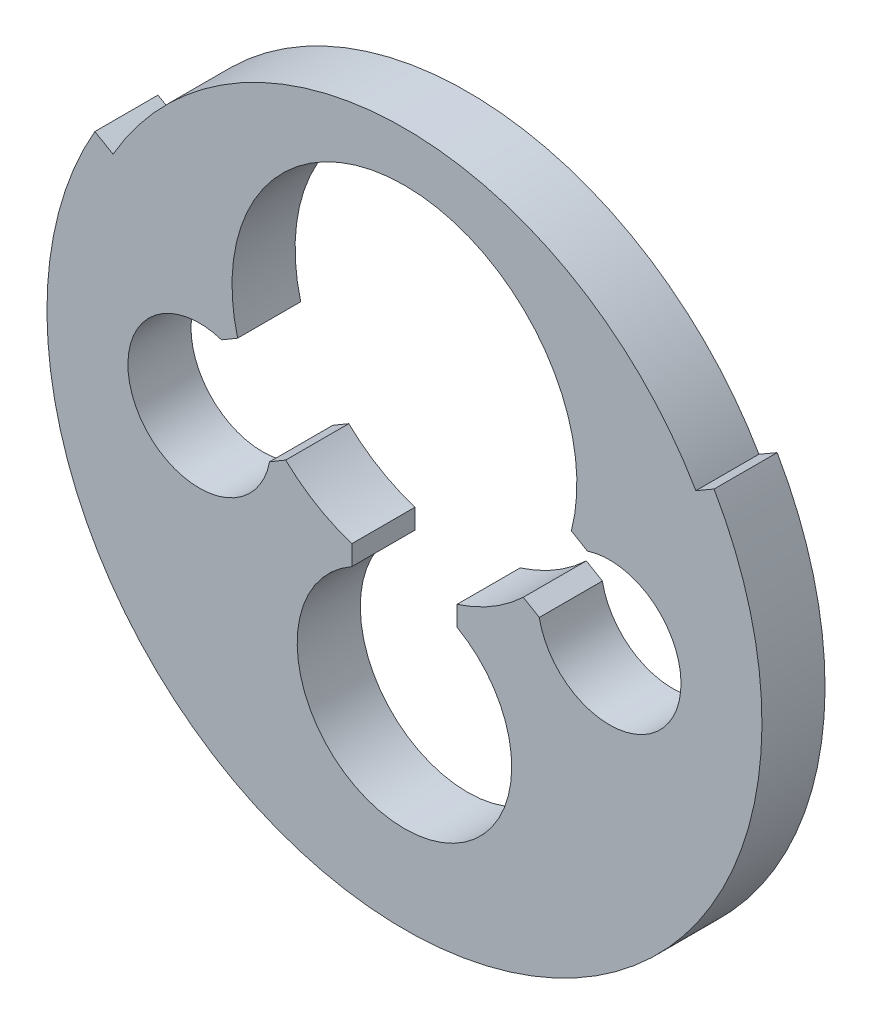
ISO-10303-21;
HEADER;
FILE_DESCRIPTION(('STEP AP214'),'2;1');
FILE_NAME('part.step','',(''),(''),'','','');
FILE_SCHEMA(('AUTOMOTIVE_DESIGN { 1 0 10303 214 1 1 1 1 }'));
ENDSEC;
DATA;
#1=APPLICATION_CONTEXT('core data for automotive mechanical design processes');
#2=APPLICATION_PROTOCOL_DEFINITION('international standard','automotive_design',2000,#1);
#3=PRODUCT_CONTEXT('',#1,'mechanical');
#4=PRODUCT('Part','Part','',(#3));
#5=PRODUCT_RELATED_PRODUCT_CATEGORY('part','',(#4));
#6=PRODUCT_DEFINITION_FORMATION('','',#4);
#7=PRODUCT_DEFINITION_CONTEXT('part definition',#1,'design');
#8=PRODUCT_DEFINITION('design','',#6,#7);
#9=PRODUCT_DEFINITION_SHAPE('','',#8);
#10=(LENGTH_UNIT() NAMED_UNIT(*) SI_UNIT(.MILLI.,.METRE.));
#11=(NAMED_UNIT(*) PLANE_ANGLE_UNIT() SI_UNIT($,.RADIAN.));
#12=(NAMED_UNIT(*) SI_UNIT($,.STERADIAN.) SOLID_ANGLE_UNIT());
#13=UNCERTAINTY_MEASURE_WITH_UNIT(LENGTH_MEASURE(1.E-05),#10,'distance_accuracy_value','');
#14=(GEOMETRIC_REPRESENTATION_CONTEXT(3) GLOBAL_UNCERTAINTY_ASSIGNED_CONTEXT((#13)) GLOBAL_UNIT_ASSIGNED_CONTEXT((#10,
#11,#12)) REPRESENTATION_CONTEXT('',''));
#15=CARTESIAN_POINT('',(0.,0.,0.));
#16=DIRECTION('',(0.,0.,1.));
#17=DIRECTION('',(1.,0.,0.));
#18=AXIS2_PLACEMENT_3D('',#15,#16,#17);
#19=CARTESIAN_POINT('',(0.,0.,1.5));
#20=DIRECTION('',(0.,0.,1.));
#21=DIRECTION('',(1.,0.,0.));
#22=AXIS2_PLACEMENT_3D('',#19,#20,#21);
#23=PLANE('',#22);
#24=CARTESIAN_POINT('',(0.,0.,1.5));
#25=DIRECTION('',(0.,0.,1.));
#26=DIRECTION('',(1.,0.,0.));
#27=AXIS2_PLACEMENT_3D('',#24,#25,#26);
#28=CIRCLE('',#27,16.);
#29=CARTESIAN_POINT('',(13.856406460551,7.99999999999997,1.5));
#30=VERTEX_POINT('',#29);
#31=CARTESIAN_POINT('',(-13.856406460551,7.99999999999997,1.5));
#32=VERTEX_POINT('',#31);
#33=EDGE_CURVE('E11',#30,#32,#28,.T.);
#34=ORIENTED_EDGE('',*,*,#33,.T.);
#35=DIRECTION('',(-0.86602540378444,0.499999999999998,0.));
#36=VECTOR('',#35,1.);
#37=CARTESIAN_POINT('',(0.,0.,1.5));
#38=LINE('',#37,#36);
#39=CARTESIAN_POINT('',(-14.7224318643355,8.49999999999996,1.5));
#40=VERTEX_POINT('',#39);
#41=EDGE_CURVE('E173',#32,#40,#38,.T.);
#42=ORIENTED_EDGE('',*,*,#41,.T.);
#43=CARTESIAN_POINT('',(0.,0.,1.5));
#44=DIRECTION('',(0.,0.,1.));
#45=DIRECTION('',(1.,0.,0.));
#46=AXIS2_PLACEMENT_3D('',#43,#44,#45);
#47=CIRCLE('',#46,17.);
#48=CARTESIAN_POINT('',(14.7224318643355,8.49999999999996,1.5));
#49=VERTEX_POINT('',#48);
#50=EDGE_CURVE('E169',#40,#49,#47,.T.);
#51=ORIENTED_EDGE('',*,*,#50,.T.);
#52=DIRECTION('',(0.866025403784441,0.499999999999997,0.));
#53=VECTOR('',#52,1.);
#54=CARTESIAN_POINT('',(0.,0.,1.5));
#55=LINE('',#54,#53);
#56=EDGE_CURVE('E166',#30,#49,#55,.T.);
#57=ORIENTED_EDGE('',*,*,#56,.F.);
#58=EDGE_LOOP('',(#34,#42,#51,#57));
#59=FACE_BOUND('',#58,.T.);
#60=DIRECTION('',(-0.861365903383803,0.507985019944294,0.));
#61=VECTOR('',#60,1.);
#62=CARTESIAN_POINT('',(8.69732788002115,2.9329369631682,1.5));
#63=LINE('',#62,#61);
#64=CARTESIAN_POINT('',(8.69732788002115,2.9329369631682,1.5));
#65=VERTEX_POINT('',#64);
#66=CARTESIAN_POINT('',(7.93506994184734,3.38247369593737,1.5));
#67=VERTEX_POINT('',#66);
#68=EDGE_CURVE('E181',#65,#67,#63,.T.);
#69=ORIENTED_EDGE('',*,*,#68,.F.);
#70=CARTESIAN_POINT('',(9.75000000000002,-0.299999999999998,1.5));
#71=DIRECTION('',(0.,0.,1.));
#72=DIRECTION('',(-1.,0.,0.));
#73=AXIS2_PLACEMENT_3D('',#70,#71,#72);
#74=CIRCLE('',#73,3.4);
#75=CARTESIAN_POINT('',(6.41139529027183,-0.943209602058916,1.5));
#76=VERTEX_POINT('',#75);
#77=EDGE_CURVE('E179',#76,#65,#74,.T.);
#78=ORIENTED_EDGE('',*,*,#77,.F.);
#79=DIRECTION('',(0.861365903383804,-0.507985019944293,0.));
#80=VECTOR('',#79,1.);
#81=CARTESIAN_POINT('',(6.41139529027183,-0.943209602058916,1.5));
#82=LINE('',#81,#80);
#83=CARTESIAN_POINT('',(5.64913735209802,-0.493672869289745,1.5));
#84=VERTEX_POINT('',#83);
#85=EDGE_CURVE('E203',#84,#76,#82,.T.);
#86=ORIENTED_EDGE('',*,*,#85,.F.);
#87=CARTESIAN_POINT('',(0.,5.45,1.5));
#88=DIRECTION('',(0.,0.,1.));
#89=DIRECTION('',(1.,0.,0.));
#90=AXIS2_PLACEMENT_3D('',#87,#88,#89);
#91=CIRCLE('',#90,8.2);
#92=CARTESIAN_POINT('',(2.5,-2.35960946526777,1.5));
#93=VERTEX_POINT('',#92);
#94=EDGE_CURVE('E200',#93,#84,#91,.T.);
#95=ORIENTED_EDGE('',*,*,#94,.F.);
#96=DIRECTION('',(0.,1.,0.));
#97=VECTOR('',#96,1.);
#98=CARTESIAN_POINT('',(2.5,-2.35960946526777,1.5));
#99=LINE('',#98,#97);
#100=CARTESIAN_POINT('',(2.5,-3.30477784582143,1.5));
#101=VERTEX_POINT('',#100);
#102=EDGE_CURVE('E198',#101,#93,#99,.T.);
#103=ORIENTED_EDGE('',*,*,#102,.F.);
#104=CARTESIAN_POINT('',(0.,-7.75,1.5));
#105=DIRECTION('',(0.,0.,1.));
#106=DIRECTION('',(1.,0.,0.));
#107=AXIS2_PLACEMENT_3D('',#104,#105,#106);
#108=CIRCLE('',#107,5.1);
#109=CARTESIAN_POINT('',(-2.5,-3.30477784582143,1.5));
#110=VERTEX_POINT('',#109);
#111=EDGE_CURVE('E196',#110,#101,#108,.T.);
#112=ORIENTED_EDGE('',*,*,#111,.F.);
#113=DIRECTION('',(0.,-1.,0.));
#114=VECTOR('',#113,1.);
#115=CARTESIAN_POINT('',(-2.5,-2.35960946526777,1.5));
#116=LINE('',#115,#114);
#117=CARTESIAN_POINT('',(-2.5,-2.35960946526777,1.5));
#118=VERTEX_POINT('',#117);
#119=EDGE_CURVE('E194',#118,#110,#116,.T.);
#120=ORIENTED_EDGE('',*,*,#119,.F.);
#121=CARTESIAN_POINT('',(0.,5.45,1.5));
#122=DIRECTION('',(0.,0.,1.));
#123=DIRECTION('',(1.,0.,0.));
#124=AXIS2_PLACEMENT_3D('',#121,#122,#123);
#125=CIRCLE('',#124,8.2);
#126=CARTESIAN_POINT('',(-5.64913735209802,-0.493672869289742,1.5));
#127=VERTEX_POINT('',#126);
#128=EDGE_CURVE('E192',#127,#118,#125,.T.);
#129=ORIENTED_EDGE('',*,*,#128,.F.);
#130=DIRECTION('',(0.861365903383803,0.507985019944293,0.));
#131=VECTOR('',#130,1.);
#132=CARTESIAN_POINT('',(-6.41139529027183,-0.943209602058917,1.5));
#133=LINE('',#132,#131);
#134=CARTESIAN_POINT('',(-6.41139529027183,-0.943209602058917,1.5));
#135=VERTEX_POINT('',#134);
#136=EDGE_CURVE('E190',#135,#127,#133,.T.);
#137=ORIENTED_EDGE('',*,*,#136,.F.);
#138=CARTESIAN_POINT('',(-9.75000000000001,-0.3,1.5));
#139=DIRECTION('',(0.,0.,1.));
#140=DIRECTION('',(1.,0.,0.));
#141=AXIS2_PLACEMENT_3D('',#138,#139,#140);
#142=CIRCLE('',#141,3.4);
#143=CARTESIAN_POINT('',(-8.69732788002115,2.9329369631682,1.5));
#144=VERTEX_POINT('',#143);
#145=EDGE_CURVE('E188',#144,#135,#142,.T.);
#146=ORIENTED_EDGE('',*,*,#145,.F.);
#147=DIRECTION('',(-0.861365903383803,-0.507985019944294,0.));
#148=VECTOR('',#147,1.);
#149=CARTESIAN_POINT('',(-8.69732788002115,2.9329369631682,1.5));
#150=LINE('',#149,#148);
#151=CARTESIAN_POINT('',(-7.93506994184734,3.38247369593737,1.5));
#152=VERTEX_POINT('',#151);
#153=EDGE_CURVE('E186',#152,#144,#150,.T.);
#154=ORIENTED_EDGE('',*,*,#153,.F.);
#155=CARTESIAN_POINT('',(0.,5.45,1.5));
#156=DIRECTION('',(0.,0.,1.));
#157=DIRECTION('',(1.,0.,0.));
#158=AXIS2_PLACEMENT_3D('',#155,#156,#157);
#159=CIRCLE('',#158,8.2);
#160=EDGE_CURVE('E184',#67,#152,#159,.T.);
#161=ORIENTED_EDGE('',*,*,#160,.F.);
#162=EDGE_LOOP('',(#69,#78,#86,#95,#103,#112,#120,#129,#137,#146,#154,#161));
#163=FACE_BOUND('',#162,.T.);
#164=ADVANCED_FACE('F35',(#59,#163),#23,.T.);
#165=CARTESIAN_POINT('',(0.,0.,-1.5));
#166=DIRECTION('',(0.,0.,1.));
#167=DIRECTION('',(1.,0.,0.));
#168=AXIS2_PLACEMENT_3D('',#165,#166,#167);
#169=PLANE('',#168);
#170=CARTESIAN_POINT('',(0.,0.,-1.5));
#171=DIRECTION('',(0.,0.,1.));
#172=DIRECTION('',(1.,0.,0.));
#173=AXIS2_PLACEMENT_3D('',#170,#171,#172);
#174=CIRCLE('',#173,16.);
#175=CARTESIAN_POINT('',(13.856406460551,7.99999999999997,-1.5));
#176=VERTEX_POINT('',#175);
#177=CARTESIAN_POINT('',(-13.856406460551,7.99999999999997,-1.5));
#178=VERTEX_POINT('',#177);
#179=EDGE_CURVE('E39',#176,#178,#174,.T.);
#180=ORIENTED_EDGE('',*,*,#179,.F.);
#181=DIRECTION('',(-0.866025403784441,-0.499999999999997,0.));
#182=VECTOR('',#181,1.);
#183=CARTESIAN_POINT('',(0.,0.,-1.5));
#184=LINE('',#183,#182);
#185=CARTESIAN_POINT('',(14.7224318643355,8.49999999999996,-1.5));
#186=VERTEX_POINT('',#185);
#187=EDGE_CURVE('E149',#186,#176,#184,.T.);
#188=ORIENTED_EDGE('',*,*,#187,.F.);
#189=CARTESIAN_POINT('',(0.,0.,-1.5));
#190=DIRECTION('',(0.,0.,1.));
#191=DIRECTION('',(1.,0.,0.));
#192=AXIS2_PLACEMENT_3D('',#189,#190,#191);
#193=CIRCLE('',#192,17.);
#194=CARTESIAN_POINT('',(-14.7224318643355,8.49999999999996,-1.5));
#195=VERTEX_POINT('',#194);
#196=EDGE_CURVE('E162',#186,#195,#193,.F.);
#197=ORIENTED_EDGE('',*,*,#196,.T.);
#198=DIRECTION('',(0.86602540378444,-0.499999999999998,0.));
#199=VECTOR('',#198,1.);
#200=CARTESIAN_POINT('',(0.,0.,-1.5));
#201=LINE('',#200,#199);
#202=EDGE_CURVE('E152',#195,#178,#201,.T.);
#203=ORIENTED_EDGE('',*,*,#202,.T.);
#204=EDGE_LOOP('',(#180,#188,#197,#203));
#205=FACE_BOUND('',#204,.T.);
#206=CARTESIAN_POINT('',(9.75000000000002,-0.299999999999998,-1.5));
#207=DIRECTION('',(0.,0.,1.));
#208=DIRECTION('',(-1.,0.,0.));
#209=AXIS2_PLACEMENT_3D('',#206,#207,#208);
#210=CIRCLE('',#209,3.4);
#211=CARTESIAN_POINT('',(6.41139529027183,-0.943209602058916,-1.5));
#212=VERTEX_POINT('',#211);
#213=CARTESIAN_POINT('',(8.69732788002115,2.9329369631682,-1.5));
#214=VERTEX_POINT('',#213);
#215=EDGE_CURVE('E172',#212,#214,#210,.T.);
#216=ORIENTED_EDGE('',*,*,#215,.T.);
#217=DIRECTION('',(-0.861365903383803,0.507985019944294,0.));
#218=VECTOR('',#217,1.);
#219=CARTESIAN_POINT('',(8.69732788002115,2.9329369631682,-1.5));
#220=LINE('',#219,#218);
#221=CARTESIAN_POINT('',(7.93506994184734,3.38247369593737,-1.5));
#222=VERTEX_POINT('',#221);
#223=EDGE_CURVE('E208',#214,#222,#220,.T.);
#224=ORIENTED_EDGE('',*,*,#223,.T.);
#225=CARTESIAN_POINT('',(0.,5.45,-1.5));
#226=DIRECTION('',(0.,0.,1.));
#227=DIRECTION('',(1.,0.,0.));
#228=AXIS2_PLACEMENT_3D('',#225,#226,#227);
#229=CIRCLE('',#228,8.2);
#230=CARTESIAN_POINT('',(-7.93506994184734,3.38247369593737,-1.5));
#231=VERTEX_POINT('',#230);
#232=EDGE_CURVE('E211',#222,#231,#229,.T.);
#233=ORIENTED_EDGE('',*,*,#232,.T.);
#234=DIRECTION('',(-0.861365903383803,-0.507985019944294,0.));
#235=VECTOR('',#234,1.);
#236=CARTESIAN_POINT('',(-8.69732788002115,2.9329369631682,-1.5));
#237=LINE('',#236,#235);
#238=CARTESIAN_POINT('',(-8.69732788002115,2.9329369631682,-1.5));
#239=VERTEX_POINT('',#238);
#240=EDGE_CURVE('E214',#231,#239,#237,.T.);
#241=ORIENTED_EDGE('',*,*,#240,.T.);
#242=CARTESIAN_POINT('',(-9.75000000000001,-0.3,-1.5));
#243=DIRECTION('',(0.,0.,1.));
#244=DIRECTION('',(1.,0.,0.));
#245=AXIS2_PLACEMENT_3D('',#242,#243,#244);
#246=CIRCLE('',#245,3.4);
#247=CARTESIAN_POINT('',(-6.41139529027183,-0.943209602058917,-1.5));
#248=VERTEX_POINT('',#247);
#249=EDGE_CURVE('E217',#239,#248,#246,.T.);
#250=ORIENTED_EDGE('',*,*,#249,.T.);
#251=DIRECTION('',(0.861365903383803,0.507985019944293,0.));
#252=VECTOR('',#251,1.);
#253=CARTESIAN_POINT('',(-6.41139529027183,-0.943209602058917,-1.5));
#254=LINE('',#253,#252);
#255=CARTESIAN_POINT('',(-5.64913735209802,-0.493672869289742,-1.5));
#256=VERTEX_POINT('',#255);
#257=EDGE_CURVE('E220',#248,#256,#254,.T.);
#258=ORIENTED_EDGE('',*,*,#257,.T.);
#259=CARTESIAN_POINT('',(0.,5.45,-1.5));
#260=DIRECTION('',(0.,0.,1.));
#261=DIRECTION('',(1.,0.,0.));
#262=AXIS2_PLACEMENT_3D('',#259,#260,#261);
#263=CIRCLE('',#262,8.2);
#264=CARTESIAN_POINT('',(-2.5,-2.35960946526777,-1.5));
#265=VERTEX_POINT('',#264);
#266=EDGE_CURVE('E223',#256,#265,#263,.T.);
#267=ORIENTED_EDGE('',*,*,#266,.T.);
#268=DIRECTION('',(0.,-1.,0.));
#269=VECTOR('',#268,1.);
#270=CARTESIAN_POINT('',(-2.5,-2.35960946526777,-1.5));
#271=LINE('',#270,#269);
#272=CARTESIAN_POINT('',(-2.5,-3.30477784582143,-1.5));
#273=VERTEX_POINT('',#272);
#274=EDGE_CURVE('E226',#265,#273,#271,.T.);
#275=ORIENTED_EDGE('',*,*,#274,.T.);
#276=CARTESIAN_POINT('',(0.,-7.75,-1.5));
#277=DIRECTION('',(0.,0.,1.));
#278=DIRECTION('',(1.,0.,0.));
#279=AXIS2_PLACEMENT_3D('',#276,#277,#278);
#280=CIRCLE('',#279,5.1);
#281=CARTESIAN_POINT('',(2.5,-3.30477784582143,-1.5));
#282=VERTEX_POINT('',#281);
#283=EDGE_CURVE('E229',#273,#282,#280,.T.);
#284=ORIENTED_EDGE('',*,*,#283,.T.);
#285=DIRECTION('',(0.,1.,0.));
#286=VECTOR('',#285,1.);
#287=CARTESIAN_POINT('',(2.5,-2.35960946526777,-1.5));
#288=LINE('',#287,#286);
#289=CARTESIAN_POINT('',(2.5,-2.35960946526777,-1.5));
#290=VERTEX_POINT('',#289);
#291=EDGE_CURVE('E232',#282,#290,#288,.T.);
#292=ORIENTED_EDGE('',*,*,#291,.T.);
#293=CARTESIAN_POINT('',(0.,5.45,-1.5));
#294=DIRECTION('',(0.,0.,1.));
#295=DIRECTION('',(1.,0.,0.));
#296=AXIS2_PLACEMENT_3D('',#293,#294,#295);
#297=CIRCLE('',#296,8.2);
#298=CARTESIAN_POINT('',(5.64913735209802,-0.493672869289744,-1.5));
#299=VERTEX_POINT('',#298);
#300=EDGE_CURVE('E235',#290,#299,#297,.T.);
#301=ORIENTED_EDGE('',*,*,#300,.T.);
#302=DIRECTION('',(0.861365903383804,-0.507985019944293,0.));
#303=VECTOR('',#302,1.);
#304=CARTESIAN_POINT('',(6.41139529027183,-0.943209602058916,-1.5));
#305=LINE('',#304,#303);
#306=EDGE_CURVE('E182',#299,#212,#305,.T.);
#307=ORIENTED_EDGE('',*,*,#306,.T.);
#308=EDGE_LOOP('',(#216,#224,#233,#241,#250,#258,#267,#275,#284,#292,#301,#307));
#309=FACE_BOUND('',#308,.T.);
#310=ADVANCED_FACE('F145',(#205,#309),#169,.F.);
#311=CARTESIAN_POINT('',(0.,0.,1.5));
#312=DIRECTION('',(0.,0.,-1.));
#313=DIRECTION('',(-1.,0.,0.));
#314=AXIS2_PLACEMENT_3D('',#311,#312,#313);
#315=CYLINDRICAL_SURFACE('',#314,16.);
#316=ORIENTED_EDGE('',*,*,#33,.F.);
#317=DIRECTION('',(0.,0.,-1.));
#318=VECTOR('',#317,1.);
#319=CARTESIAN_POINT('',(13.856406460551,7.99999999999997,44.));
#320=LINE('',#319,#318);
#321=EDGE_CURVE('E154',#30,#176,#320,.T.);
#322=ORIENTED_EDGE('',*,*,#321,.T.);
#323=ORIENTED_EDGE('',*,*,#179,.T.);
#324=DIRECTION('',(0.,0.,-1.));
#325=VECTOR('',#324,1.);
#326=CARTESIAN_POINT('',(-13.856406460551,7.99999999999997,44.));
#327=LINE('',#326,#325);
#328=EDGE_CURVE('E50',#32,#178,#327,.T.);
#329=ORIENTED_EDGE('',*,*,#328,.F.);
#330=EDGE_LOOP('',(#316,#322,#323,#329));
#331=FACE_BOUND('',#330,.T.);
#332=ADVANCED_FACE('F37',(#331),#315,.T.);
#333=CARTESIAN_POINT('',(9.75000000000002,-0.299999999999998,1.5));
#334=DIRECTION('',(0.,0.,-1.));
#335=DIRECTION('',(-1.,0.,0.));
#336=AXIS2_PLACEMENT_3D('',#333,#334,#335);
#337=CYLINDRICAL_SURFACE('',#336,3.4);
#338=ORIENTED_EDGE('',*,*,#215,.F.);
#339=DIRECTION('',(0.,0.,-1.));
#340=VECTOR('',#339,1.);
#341=CARTESIAN_POINT('',(6.41139529027183,-0.943209602058916,1.5));
#342=LINE('',#341,#340);
#343=EDGE_CURVE('E205',#76,#212,#342,.T.);
#344=ORIENTED_EDGE('',*,*,#343,.F.);
#345=ORIENTED_EDGE('',*,*,#77,.T.);
#346=DIRECTION('',(0.,0.,-1.));
#347=VECTOR('',#346,1.);
#348=CARTESIAN_POINT('',(8.69732788002115,2.9329369631682,1.5));
#349=LINE('',#348,#347);
#350=EDGE_CURVE('E153',#65,#214,#349,.T.);
#351=ORIENTED_EDGE('',*,*,#350,.T.);
#352=EDGE_LOOP('',(#338,#344,#345,#351));
#353=FACE_BOUND('',#352,.T.);
#354=ADVANCED_FACE('F265',(#353),#337,.F.);
#355=CARTESIAN_POINT('',(8.69732788002115,2.9329369631682,1.5));
#356=DIRECTION('',(-0.507985019944294,-0.861365903383803,0.));
#357=DIRECTION('',(0.861365903383803,-0.507985019944294,0.));
#358=AXIS2_PLACEMENT_3D('',#355,#356,#357);
#359=PLANE('',#358);
#360=ORIENTED_EDGE('',*,*,#223,.F.);
#361=ORIENTED_EDGE('',*,*,#350,.F.);
#362=ORIENTED_EDGE('',*,*,#68,.T.);
#363=DIRECTION('',(0.,0.,-1.));
#364=VECTOR('',#363,1.);
#365=CARTESIAN_POINT('',(7.93506994184734,3.38247369593737,1.5));
#366=LINE('',#365,#364);
#367=EDGE_CURVE('E260',#67,#222,#366,.T.);
#368=ORIENTED_EDGE('',*,*,#367,.T.);
#369=EDGE_LOOP('',(#360,#361,#362,#368));
#370=FACE_BOUND('',#369,.T.);
#371=ADVANCED_FACE('F280',(#370),#359,.T.);
#372=CARTESIAN_POINT('',(0.,5.45,1.5));
#373=DIRECTION('',(0.,0.,-1.));
#374=DIRECTION('',(-1.,0.,0.));
#375=AXIS2_PLACEMENT_3D('',#372,#373,#374);
#376=CYLINDRICAL_SURFACE('',#375,8.2);
#377=ORIENTED_EDGE('',*,*,#232,.F.);
#378=ORIENTED_EDGE('',*,*,#367,.F.);
#379=ORIENTED_EDGE('',*,*,#160,.T.);
#380=DIRECTION('',(0.,0.,-1.));
#381=VECTOR('',#380,1.);
#382=CARTESIAN_POINT('',(-7.93506994184734,3.38247369593737,1.5));
#383=LINE('',#382,#381);
#384=EDGE_CURVE('E258',#152,#231,#383,.T.);
#385=ORIENTED_EDGE('',*,*,#384,.T.);
#386=EDGE_LOOP('',(#377,#378,#379,#385));
#387=FACE_BOUND('',#386,.T.);
#388=ADVANCED_FACE('F283',(#387),#376,.F.);
#389=CARTESIAN_POINT('',(-8.69732788002115,2.9329369631682,1.5));
#390=DIRECTION('',(0.507985019944294,-0.861365903383803,0.));
#391=DIRECTION('',(0.861365903383803,0.507985019944294,0.));
#392=AXIS2_PLACEMENT_3D('',#389,#390,#391);
#393=PLANE('',#392);
#394=ORIENTED_EDGE('',*,*,#240,.F.);
#395=ORIENTED_EDGE('',*,*,#384,.F.);
#396=ORIENTED_EDGE('',*,*,#153,.T.);
#397=DIRECTION('',(0.,0.,-1.));
#398=VECTOR('',#397,1.);
#399=CARTESIAN_POINT('',(-8.69732788002115,2.9329369631682,1.5));
#400=LINE('',#399,#398);
#401=EDGE_CURVE('E256',#144,#239,#400,.T.);
#402=ORIENTED_EDGE('',*,*,#401,.T.);
#403=EDGE_LOOP('',(#394,#395,#396,#402));
#404=FACE_BOUND('',#403,.T.);
#405=ADVANCED_FACE('F288',(#404),#393,.T.);
#406=CARTESIAN_POINT('',(-9.75000000000001,-0.3,1.5));
#407=DIRECTION('',(0.,0.,-1.));
#408=DIRECTION('',(-1.,0.,0.));
#409=AXIS2_PLACEMENT_3D('',#406,#407,#408);
#410=CYLINDRICAL_SURFACE('',#409,3.4);
#411=ORIENTED_EDGE('',*,*,#249,.F.);
#412=ORIENTED_EDGE('',*,*,#401,.F.);
#413=ORIENTED_EDGE('',*,*,#145,.T.);
#414=DIRECTION('',(0.,0.,-1.));
#415=VECTOR('',#414,1.);
#416=CARTESIAN_POINT('',(-6.41139529027183,-0.943209602058917,1.5));
#417=LINE('',#416,#415);
#418=EDGE_CURVE('E254',#135,#248,#417,.T.);
#419=ORIENTED_EDGE('',*,*,#418,.T.);
#420=EDGE_LOOP('',(#411,#412,#413,#419));
#421=FACE_BOUND('',#420,.T.);
#422=ADVANCED_FACE('F292',(#421),#410,.F.);
#423=CARTESIAN_POINT('',(-6.41139529027183,-0.943209602058917,1.5));
#424=DIRECTION('',(-0.507985019944293,0.861365903383804,0.));
#425=DIRECTION('',(-0.861365903383804,-0.507985019944293,0.));
#426=AXIS2_PLACEMENT_3D('',#423,#424,#425);
#427=PLANE('',#426);
#428=ORIENTED_EDGE('',*,*,#257,.F.);
#429=ORIENTED_EDGE('',*,*,#418,.F.);
#430=ORIENTED_EDGE('',*,*,#136,.T.);
#431=DIRECTION('',(0.,0.,-1.));
#432=VECTOR('',#431,1.);
#433=CARTESIAN_POINT('',(-5.64913735209802,-0.493672869289742,1.5));
#434=LINE('',#433,#432);
#435=EDGE_CURVE('E252',#127,#256,#434,.T.);
#436=ORIENTED_EDGE('',*,*,#435,.T.);
#437=EDGE_LOOP('',(#428,#429,#430,#436));
#438=FACE_BOUND('',#437,.T.);
#439=ADVANCED_FACE('F297',(#438),#427,.T.);
#440=CARTESIAN_POINT('',(0.,5.45,1.5));
#441=DIRECTION('',(0.,0.,-1.));
#442=DIRECTION('',(-1.,0.,0.));
#443=AXIS2_PLACEMENT_3D('',#440,#441,#442);
#444=CYLINDRICAL_SURFACE('',#443,8.2);
#445=ORIENTED_EDGE('',*,*,#266,.F.);
#446=ORIENTED_EDGE('',*,*,#435,.F.);
#447=ORIENTED_EDGE('',*,*,#128,.T.);
#448=DIRECTION('',(0.,0.,-1.));
#449=VECTOR('',#448,1.);
#450=CARTESIAN_POINT('',(-2.5,-2.35960946526777,1.5));
#451=LINE('',#450,#449);
#452=EDGE_CURVE('E250',#118,#265,#451,.T.);
#453=ORIENTED_EDGE('',*,*,#452,.T.);
#454=EDGE_LOOP('',(#445,#446,#447,#453));
#455=FACE_BOUND('',#454,.T.);
#456=ADVANCED_FACE('F302',(#455),#444,.F.);
#457=CARTESIAN_POINT('',(-2.5,-2.35960946526777,1.5));
#458=DIRECTION('',(1.,0.,0.));
#459=DIRECTION('',(0.,0.,-1.));
#460=AXIS2_PLACEMENT_3D('',#457,#458,#459);
#461=PLANE('',#460);
#462=ORIENTED_EDGE('',*,*,#274,.F.);
#463=ORIENTED_EDGE('',*,*,#452,.F.);
#464=ORIENTED_EDGE('',*,*,#119,.T.);
#465=DIRECTION('',(0.,0.,-1.));
#466=VECTOR('',#465,1.);
#467=CARTESIAN_POINT('',(-2.5,-3.30477784582143,1.5));
#468=LINE('',#467,#466);
#469=EDGE_CURVE('E248',#110,#273,#468,.T.);
#470=ORIENTED_EDGE('',*,*,#469,.T.);
#471=EDGE_LOOP('',(#462,#463,#464,#470));
#472=FACE_BOUND('',#471,.T.);
#473=ADVANCED_FACE('F307',(#472),#461,.T.);
#474=CARTESIAN_POINT('',(0.,-7.75,1.5));
#475=DIRECTION('',(0.,0.,-1.));
#476=DIRECTION('',(-1.,0.,0.));
#477=AXIS2_PLACEMENT_3D('',#474,#475,#476);
#478=CYLINDRICAL_SURFACE('',#477,5.1);
#479=ORIENTED_EDGE('',*,*,#283,.F.);
#480=ORIENTED_EDGE('',*,*,#469,.F.);
#481=ORIENTED_EDGE('',*,*,#111,.T.);
#482=DIRECTION('',(0.,0.,-1.));
#483=VECTOR('',#482,1.);
#484=CARTESIAN_POINT('',(2.5,-3.30477784582143,1.5));
#485=LINE('',#484,#483);
#486=EDGE_CURVE('E246',#101,#282,#485,.T.);
#487=ORIENTED_EDGE('',*,*,#486,.T.);
#488=EDGE_LOOP('',(#479,#480,#481,#487));
#489=FACE_BOUND('',#488,.T.);
#490=ADVANCED_FACE('F312',(#489),#478,.F.);
#491=CARTESIAN_POINT('',(2.5,-2.35960946526777,1.5));
#492=DIRECTION('',(-1.,0.,0.));
#493=DIRECTION('',(0.,0.,1.));
#494=AXIS2_PLACEMENT_3D('',#491,#492,#493);
#495=PLANE('',#494);
#496=ORIENTED_EDGE('',*,*,#291,.F.);
#497=ORIENTED_EDGE('',*,*,#486,.F.);
#498=ORIENTED_EDGE('',*,*,#102,.T.);
#499=DIRECTION('',(0.,0.,-1.));
#500=VECTOR('',#499,1.);
#501=CARTESIAN_POINT('',(2.5,-2.35960946526777,1.5));
#502=LINE('',#501,#500);
#503=EDGE_CURVE('E244',#93,#290,#502,.T.);
#504=ORIENTED_EDGE('',*,*,#503,.T.);
#505=EDGE_LOOP('',(#496,#497,#498,#504));
#506=FACE_BOUND('',#505,.T.);
#507=ADVANCED_FACE('F316',(#506),#495,.T.);
#508=CARTESIAN_POINT('',(0.,5.45,1.5));
#509=DIRECTION('',(0.,0.,-1.));
#510=DIRECTION('',(-1.,0.,0.));
#511=AXIS2_PLACEMENT_3D('',#508,#509,#510);
#512=CYLINDRICAL_SURFACE('',#511,8.2);
#513=ORIENTED_EDGE('',*,*,#300,.F.);
#514=ORIENTED_EDGE('',*,*,#503,.F.);
#515=ORIENTED_EDGE('',*,*,#94,.T.);
#516=DIRECTION('',(0.,0.,-1.));
#517=VECTOR('',#516,1.);
#518=CARTESIAN_POINT('',(5.64913735209802,-0.493672869289744,1.5));
#519=LINE('',#518,#517);
#520=EDGE_CURVE('E242',#84,#299,#519,.T.);
#521=ORIENTED_EDGE('',*,*,#520,.T.);
#522=EDGE_LOOP('',(#513,#514,#515,#521));
#523=FACE_BOUND('',#522,.T.);
#524=ADVANCED_FACE('F320',(#523),#512,.F.);
#525=CARTESIAN_POINT('',(6.41139529027183,-0.943209602058916,1.5));
#526=DIRECTION('',(0.507985019944293,0.861365903383804,0.));
#527=DIRECTION('',(-0.861365903383804,0.507985019944293,0.));
#528=AXIS2_PLACEMENT_3D('',#525,#526,#527);
#529=PLANE('',#528);
#530=ORIENTED_EDGE('',*,*,#306,.F.);
#531=ORIENTED_EDGE('',*,*,#520,.F.);
#532=ORIENTED_EDGE('',*,*,#85,.T.);
#533=ORIENTED_EDGE('',*,*,#343,.T.);
#534=EDGE_LOOP('',(#530,#531,#532,#533));
#535=FACE_BOUND('',#534,.T.);
#536=ADVANCED_FACE('F273',(#535),#529,.T.);
#537=CARTESIAN_POINT('',(0.,0.,44.));
#538=DIRECTION('',(0.,0.,-1.));
#539=DIRECTION('',(-1.,0.,0.));
#540=AXIS2_PLACEMENT_3D('',#537,#538,#539);
#541=CYLINDRICAL_SURFACE('',#540,17.);
#542=ORIENTED_EDGE('',*,*,#50,.F.);
#543=DIRECTION('',(0.,0.,-1.));
#544=VECTOR('',#543,1.);
#545=CARTESIAN_POINT('',(-14.7224318643355,8.49999999999996,44.));
#546=LINE('',#545,#544);
#547=EDGE_CURVE('E168',#40,#195,#546,.T.);
#548=ORIENTED_EDGE('',*,*,#547,.T.);
#549=ORIENTED_EDGE('',*,*,#196,.F.);
#550=DIRECTION('',(0.,0.,-1.));
#551=VECTOR('',#550,1.);
#552=CARTESIAN_POINT('',(14.7224318643355,8.49999999999996,44.));
#553=LINE('',#552,#551);
#554=EDGE_CURVE('E157',#49,#186,#553,.T.);
#555=ORIENTED_EDGE('',*,*,#554,.F.);
#556=EDGE_LOOP('',(#542,#548,#549,#555));
#557=FACE_BOUND('',#556,.T.);
#558=ADVANCED_FACE('F327',(#557),#541,.T.);
#559=CARTESIAN_POINT('',(0.,0.,44.));
#560=DIRECTION('',(-0.499999999999997,0.866025403784441,0.));
#561=DIRECTION('',(-0.866025403784441,-0.499999999999997,0.));
#562=AXIS2_PLACEMENT_3D('',#559,#560,#561);
#563=PLANE('',#562);
#564=ORIENTED_EDGE('',*,*,#321,.F.);
#565=ORIENTED_EDGE('',*,*,#56,.T.);
#566=ORIENTED_EDGE('',*,*,#554,.T.);
#567=ORIENTED_EDGE('',*,*,#187,.T.);
#568=EDGE_LOOP('',(#564,#565,#566,#567));
#569=FACE_BOUND('',#568,.T.);
#570=ADVANCED_FACE('F159',(#569),#563,.T.);
#571=CARTESIAN_POINT('',(0.,0.,44.));
#572=DIRECTION('',(-0.499999999999998,-0.86602540378444,0.));
#573=DIRECTION('',(0.86602540378444,-0.499999999999998,0.));
#574=AXIS2_PLACEMENT_3D('',#571,#572,#573);
#575=PLANE('',#574);
#576=ORIENTED_EDGE('',*,*,#41,.F.);
#577=ORIENTED_EDGE('',*,*,#328,.T.);
#578=ORIENTED_EDGE('',*,*,#202,.F.);
#579=ORIENTED_EDGE('',*,*,#547,.F.);
#580=EDGE_LOOP('',(#576,#577,#578,#579));
#581=FACE_BOUND('',#580,.T.);
#582=ADVANCED_FACE('F412',(#581),#575,.F.);
#583=CLOSED_SHELL('',(#164,#310,#332,#354,#371,#388,#405,#422,#439,#456,#473,#490,#507,#524,
#536,#558,#570,#582));
#584=MANIFOLD_SOLID_BREP('B2',#583);
#585=ADVANCED_BREP_SHAPE_REPRESENTATION('',(#18,#584),#14);
#586=SHAPE_DEFINITION_REPRESENTATION(#9,#585);
ENDSEC;
END-ISO-10303-21;
